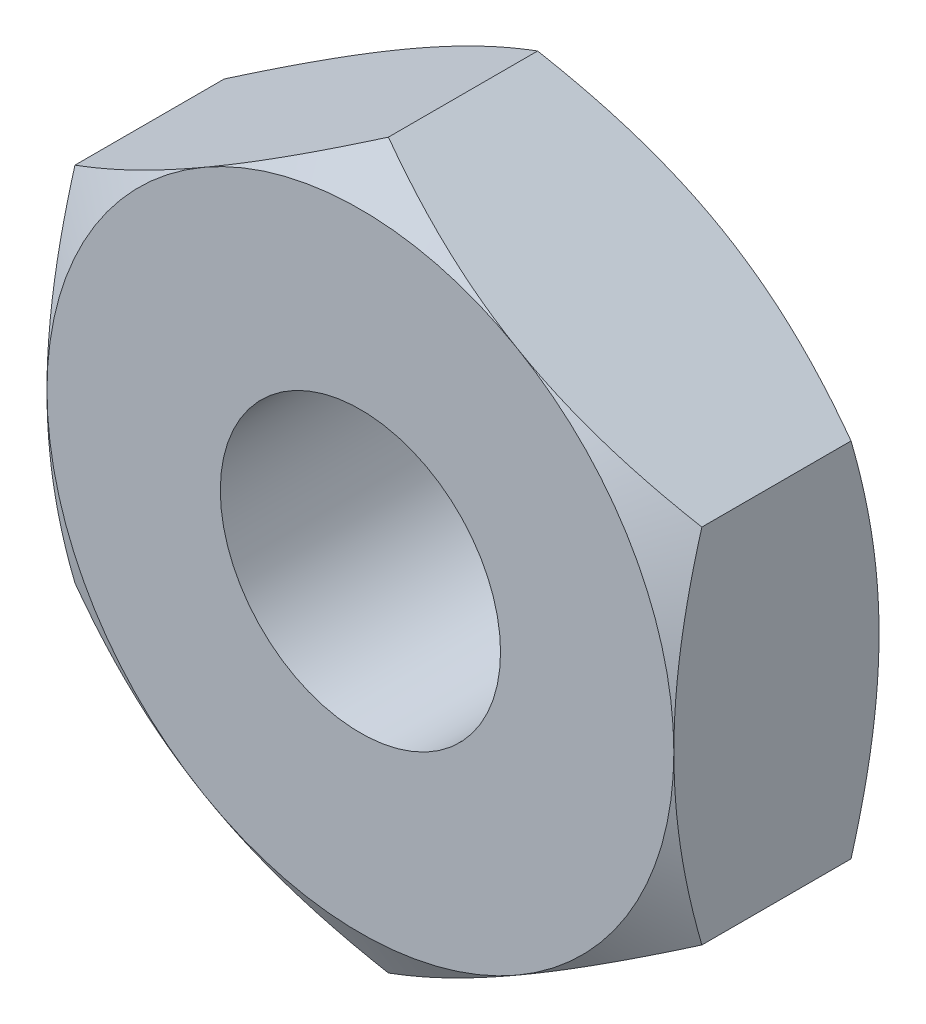
ISO-10303-21;
HEADER;
FILE_DESCRIPTION(('STEP AP214'),'2;1');
FILE_NAME('part.step','',(''),(''),'','','');
FILE_SCHEMA(('AUTOMOTIVE_DESIGN { 1 0 10303 214 1 1 1 1 }'));
ENDSEC;
DATA;
#1=APPLICATION_CONTEXT('core data for automotive mechanical design processes');
#2=APPLICATION_PROTOCOL_DEFINITION('international standard','automotive_design',2000,#1);
#3=PRODUCT_CONTEXT('',#1,'mechanical');
#4=PRODUCT('Part','Part','',(#3));
#5=PRODUCT_RELATED_PRODUCT_CATEGORY('part','',(#4));
#6=PRODUCT_DEFINITION_FORMATION('','',#4);
#7=PRODUCT_DEFINITION_CONTEXT('part definition',#1,'design');
#8=PRODUCT_DEFINITION('design','',#6,#7);
#9=PRODUCT_DEFINITION_SHAPE('','',#8);
#10=(LENGTH_UNIT() NAMED_UNIT(*) SI_UNIT(.MILLI.,.METRE.));
#11=(NAMED_UNIT(*) PLANE_ANGLE_UNIT() SI_UNIT($,.RADIAN.));
#12=(NAMED_UNIT(*) SI_UNIT($,.STERADIAN.) SOLID_ANGLE_UNIT());
#13=UNCERTAINTY_MEASURE_WITH_UNIT(LENGTH_MEASURE(1.E-05),#10,'distance_accuracy_value','');
#14=(GEOMETRIC_REPRESENTATION_CONTEXT(3) GLOBAL_UNCERTAINTY_ASSIGNED_CONTEXT((#13)) GLOBAL_UNIT_ASSIGNED_CONTEXT((#10,
#11,#12)) REPRESENTATION_CONTEXT('',''));
#15=CARTESIAN_POINT('',(0.,0.,0.));
#16=DIRECTION('',(0.,0.,1.));
#17=DIRECTION('',(1.,0.,0.));
#18=AXIS2_PLACEMENT_3D('',#15,#16,#17);
#19=CARTESIAN_POINT('',(2.75,1.58771324027147,1.8));
#20=DIRECTION('',(-0.5,-0.866025403784439,0.));
#21=DIRECTION('',(0.866025403784439,-0.5,0.));
#22=AXIS2_PLACEMENT_3D('',#19,#20,#21);
#23=PLANE('',#22);
#24=CARTESIAN_POINT('',(2.7502,1.58759777021763,1.55431323663524));
#25=CARTESIAN_POINT('',(2.6293507793401,1.65737010029699,1.59461233775074));
#26=CARTESIAN_POINT('',(2.50745839737737,1.72774469983533,1.63126309740234));
#27=CARTESIAN_POINT('',(2.26156287327211,1.86971254687003,1.6952378170302));
#28=CARTESIAN_POINT('',(2.13755536142615,1.94130831721583,1.7225391443255));
#29=CARTESIAN_POINT('',(1.89107720202406,2.08361254889599,1.76503825470588));
#30=CARTESIAN_POINT('',(1.76864448141258,2.15429911309864,1.78051888137754));
#31=CARTESIAN_POINT('',(1.52320285763109,2.29600490065923,1.79900060263006));
#32=CARTESIAN_POINT('',(1.40019484676709,2.36702360884404,1.8020170005374));
#33=CARTESIAN_POINT('',(1.17034121338921,2.49972966594897,1.79574685457145));
#34=CARTESIAN_POINT('',(1.06346120874598,2.56143686540073,1.7879998457233));
#35=CARTESIAN_POINT('',(0.850397532665251,2.68444923614046,1.76344481893565));
#36=CARTESIAN_POINT('',(0.744214598351111,2.74575398185008,1.74662841034943));
#37=CARTESIAN_POINT('',(0.530711510606816,2.86902004703206,1.70458807765404));
#38=CARTESIAN_POINT('',(0.423418383857145,2.93096576264318,1.67918591931277));
#39=CARTESIAN_POINT('',(0.210432520715949,3.05393320806134,1.62153277416002));
#40=CARTESIAN_POINT('',(0.104737054973348,3.11495651365995,1.58929533670102));
#41=CARTESIAN_POINT('',(-0.000200000000000006,3.17554195059678,1.55431323663524));
#42=B_SPLINE_CURVE_WITH_KNOTS('',3,(#24,#25,#26,#27,#28,#29,#30,#31,#32,#33,#34,#35,#36,#37,#38,
#39,#40,#41),.UNSPECIFIED.,.F.,.F.,(4,2,2,2,2,2,2,2,4),(0.,0.435912828725888,0.872873557116332,
1.29901931904672,1.72464171213574,2.09526089052938,2.46622354066374,2.84541551798557,
3.22386274754524),.UNSPECIFIED.);
#43=CARTESIAN_POINT('',(2.75,1.58771324027147,1.55437990693814));
#44=VERTEX_POINT('',#43);
#45=CARTESIAN_POINT('',(1.375,2.38156986040721,1.8));
#46=VERTEX_POINT('',#45);
#47=EDGE_CURVE('E61',#44,#46,#42,.T.);
#48=ORIENTED_EDGE('',*,*,#47,.F.);
#49=DIRECTION('',(0.,0.,-1.));
#50=VECTOR('',#49,1.);
#51=CARTESIAN_POINT('',(2.75,1.58771324027147,1.8));
#52=LINE('',#51,#50);
#53=CARTESIAN_POINT('',(2.75,1.58771324027147,0.245620093061862));
#54=VERTEX_POINT('',#53);
#55=EDGE_CURVE('E300',#44,#54,#52,.T.);
#56=ORIENTED_EDGE('',*,*,#55,.T.);
#57=CARTESIAN_POINT('',(-0.000199999999999888,3.17554195059678,0.245686763364759));
#58=CARTESIAN_POINT('',(0.120649220659906,3.10576962051743,0.205387662249262));
#59=CARTESIAN_POINT('',(0.242541602622634,3.03539502097908,0.168736902597661));
#60=CARTESIAN_POINT('',(0.488437126727893,2.89342717394438,0.1047621829698));
#61=CARTESIAN_POINT('',(0.612444638573855,2.82183140359858,0.0774608556744965));
#62=CARTESIAN_POINT('',(0.858922797975944,2.67952717191842,0.0349617452941162));
#63=CARTESIAN_POINT('',(0.981355518587417,2.60884060771577,0.0194811186224572));
#64=CARTESIAN_POINT('',(1.22679714236892,2.46713482015518,0.000999397369939901));
#65=CARTESIAN_POINT('',(1.34980515323291,2.39611611197038,-0.00201700053740086));
#66=CARTESIAN_POINT('',(1.57965878661079,2.26341005486544,0.00425314542854612));
#67=CARTESIAN_POINT('',(1.68653879125402,2.20170285541369,0.0120001542767018));
#68=CARTESIAN_POINT('',(1.89960246733475,2.07869048467395,0.0365551810643544));
#69=CARTESIAN_POINT('',(2.00578540164889,2.01738573896433,0.0533715896505701));
#70=CARTESIAN_POINT('',(2.21928848939318,1.89411967378235,0.0954119223459561));
#71=CARTESIAN_POINT('',(2.32658161614286,1.83217395817123,0.12081408068723));
#72=CARTESIAN_POINT('',(2.53956747928405,1.70920651275307,0.178467225839981));
#73=CARTESIAN_POINT('',(2.64526294502665,1.64818320715446,0.210704663298982));
#74=CARTESIAN_POINT('',(2.7502,1.58759777021763,0.24568676336476));
#75=B_SPLINE_CURVE_WITH_KNOTS('',3,(#57,#58,#59,#60,#61,#62,#63,#64,#65,#66,#67,#68,#69,#70,#71,
#72,#73,#74),.UNSPECIFIED.,.F.,.F.,(4,2,2,2,2,2,2,2,4),(0.,0.435912828725888,0.872873557116332,
1.29901931904672,1.72464171213573,2.09526089052938,2.46622354066374,2.84541551798557,
3.22386274754524),.UNSPECIFIED.);
#76=CARTESIAN_POINT('',(1.375,2.38156986040721,0.));
#77=VERTEX_POINT('',#76);
#78=EDGE_CURVE('E236',#77,#54,#75,.T.);
#79=ORIENTED_EDGE('',*,*,#78,.F.);
#80=CARTESIAN_POINT('',(0.,3.17542648054294,0.245620093061861));
#81=VERTEX_POINT('',#80);
#82=EDGE_CURVE('E254',#81,#77,#75,.T.);
#83=ORIENTED_EDGE('',*,*,#82,.F.);
#84=DIRECTION('',(0.,0.,-1.));
#85=VECTOR('',#84,1.);
#86=CARTESIAN_POINT('',(0.,3.17542648054294,1.8));
#87=LINE('',#86,#85);
#88=CARTESIAN_POINT('',(0.,3.17542648054294,1.55437990693814));
#89=VERTEX_POINT('',#88);
#90=EDGE_CURVE('E267',#89,#81,#87,.T.);
#91=ORIENTED_EDGE('',*,*,#90,.F.);
#92=EDGE_CURVE('E282',#46,#89,#42,.T.);
#93=ORIENTED_EDGE('',*,*,#92,.F.);
#94=EDGE_LOOP('',(#48,#56,#79,#83,#91,#93));
#95=FACE_BOUND('',#94,.T.);
#96=ADVANCED_FACE('F38',(#95),#23,.F.);
#97=CARTESIAN_POINT('',(0.,3.17542648054294,1.8));
#98=DIRECTION('',(0.5,-0.866025403784439,0.));
#99=DIRECTION('',(0.866025403784439,0.5,0.));
#100=AXIS2_PLACEMENT_3D('',#97,#98,#99);
#101=PLANE('',#100);
#102=CARTESIAN_POINT('',(0.000200000000000053,3.17554195059678,1.55431323663524));
#103=CARTESIAN_POINT('',(-0.120649220659906,3.10576962051743,1.59461233775074));
#104=CARTESIAN_POINT('',(-0.242541602622634,3.03539502097908,1.63126309740234));
#105=CARTESIAN_POINT('',(-0.488437126727893,2.89342717394439,1.6952378170302));
#106=CARTESIAN_POINT('',(-0.612444638573856,2.82183140359858,1.7225391443255));
#107=CARTESIAN_POINT('',(-0.858922797975944,2.67952717191842,1.76503825470588));
#108=CARTESIAN_POINT('',(-0.981355518587417,2.60884060771577,1.78051888137754));
#109=CARTESIAN_POINT('',(-1.22679714236892,2.46713482015519,1.79900060263006));
#110=CARTESIAN_POINT('',(-1.34980515323291,2.39611611197038,1.8020170005374));
#111=CARTESIAN_POINT('',(-1.57965878661079,2.26341005486544,1.79574685457145));
#112=CARTESIAN_POINT('',(-1.68653879125402,2.20170285541369,1.7879998457233));
#113=CARTESIAN_POINT('',(-1.89960246733475,2.07869048467395,1.76344481893565));
#114=CARTESIAN_POINT('',(-2.00578540164889,2.01738573896434,1.74662841034943));
#115=CARTESIAN_POINT('',(-2.21928848939318,1.89411967378235,1.70458807765404));
#116=CARTESIAN_POINT('',(-2.32658161614285,1.83217395817123,1.67918591931277));
#117=CARTESIAN_POINT('',(-2.53956747928405,1.70920651275308,1.62153277416002));
#118=CARTESIAN_POINT('',(-2.64526294502665,1.64818320715446,1.58929533670102));
#119=CARTESIAN_POINT('',(-2.7502,1.58759777021763,1.55431323663524));
#120=B_SPLINE_CURVE_WITH_KNOTS('',3,(#102,#103,#104,#105,#106,#107,#108,#109,#110,#111,#112,
#113,#114,#115,#116,#117,#118,#119),.UNSPECIFIED.,.F.,.F.,(4,2,2,2,2,2,2,2,4),(0.,
0.435912828725888,0.872873557116332,1.29901931904671,1.72464171213573,2.09526089052937,
2.46622354066374,2.84541551798557,3.22386274754524),.UNSPECIFIED.);
#121=CARTESIAN_POINT('',(-1.375,2.38156986040721,1.8));
#122=VERTEX_POINT('',#121);
#123=EDGE_CURVE('E54',#89,#122,#120,.T.);
#124=ORIENTED_EDGE('',*,*,#123,.F.);
#125=ORIENTED_EDGE('',*,*,#90,.T.);
#126=CARTESIAN_POINT('',(-2.7502,1.58759777021763,0.245686763364759));
#127=CARTESIAN_POINT('',(-2.62935077934009,1.65737010029699,0.205387662249262));
#128=CARTESIAN_POINT('',(-2.50745839737737,1.72774469983533,0.168736902597661));
#129=CARTESIAN_POINT('',(-2.26156287327211,1.86971254687003,0.1047621829698));
#130=CARTESIAN_POINT('',(-2.13755536142614,1.94130831721583,0.0774608556744971));
#131=CARTESIAN_POINT('',(-1.89107720202406,2.08361254889599,0.0349617452941167));
#132=CARTESIAN_POINT('',(-1.76864448141258,2.15429911309864,0.0194811186224577));
#133=CARTESIAN_POINT('',(-1.52320285763108,2.29600490065923,0.000999397369940247));
#134=CARTESIAN_POINT('',(-1.40019484676709,2.36702360884404,-0.00201700053740059));
#135=CARTESIAN_POINT('',(-1.17034121338921,2.49972966594897,0.00425314542854635));
#136=CARTESIAN_POINT('',(-1.06346120874598,2.56143686540073,0.012000154276702));
#137=CARTESIAN_POINT('',(-0.850397532665249,2.68444923614047,0.0365551810643545));
#138=CARTESIAN_POINT('',(-0.74421459835111,2.74575398185008,0.05337158965057));
#139=CARTESIAN_POINT('',(-0.530711510606816,2.86902004703206,0.0954119223459559));
#140=CARTESIAN_POINT('',(-0.423418383857144,2.93096576264318,0.12081408068723));
#141=CARTESIAN_POINT('',(-0.210432520715948,3.05393320806134,0.178467225839981));
#142=CARTESIAN_POINT('',(-0.104737054973347,3.11495651365995,0.210704663298981));
#143=CARTESIAN_POINT('',(0.000200000000000298,3.17554195059678,0.245686763364759));
#144=B_SPLINE_CURVE_WITH_KNOTS('',3,(#126,#127,#128,#129,#130,#131,#132,#133,#134,#135,#136,
#137,#138,#139,#140,#141,#142,#143),.UNSPECIFIED.,.F.,.F.,(4,2,2,2,2,2,2,2,4),(0.,
0.435912828725888,0.872873557116332,1.29901931904671,1.72464171213574,2.09526089052937,
2.46622354066374,2.84541551798557,3.22386274754524),.UNSPECIFIED.);
#145=CARTESIAN_POINT('',(-1.375,2.38156986040721,0.));
#146=VERTEX_POINT('',#145);
#147=EDGE_CURVE('E198',#146,#81,#144,.T.);
#148=ORIENTED_EDGE('',*,*,#147,.F.);
#149=CARTESIAN_POINT('',(-2.75,1.58771324027147,0.245620093061861));
#150=VERTEX_POINT('',#149);
#151=EDGE_CURVE('E253',#150,#146,#144,.T.);
#152=ORIENTED_EDGE('',*,*,#151,.F.);
#153=DIRECTION('',(0.,0.,-1.));
#154=VECTOR('',#153,1.);
#155=CARTESIAN_POINT('',(-2.75,1.58771324027147,1.8));
#156=LINE('',#155,#154);
#157=CARTESIAN_POINT('',(-2.75,1.58771324027147,1.55437990693814));
#158=VERTEX_POINT('',#157);
#159=EDGE_CURVE('E291',#158,#150,#156,.T.);
#160=ORIENTED_EDGE('',*,*,#159,.F.);
#161=EDGE_CURVE('E133',#122,#158,#120,.T.);
#162=ORIENTED_EDGE('',*,*,#161,.F.);
#163=EDGE_LOOP('',(#124,#125,#148,#152,#160,#162));
#164=FACE_BOUND('',#163,.T.);
#165=ADVANCED_FACE('F182',(#164),#101,.F.);
#166=CARTESIAN_POINT('',(-2.75,1.58771324027147,1.8));
#167=DIRECTION('',(1.,0.,0.));
#168=DIRECTION('',(0.,1.,0.));
#169=AXIS2_PLACEMENT_3D('',#166,#167,#168);
#170=PLANE('',#169);
#171=CARTESIAN_POINT('',(-2.75,-4.30229228232547,0.439707197618394));
#172=CARTESIAN_POINT('',(-2.75,-4.1818458840318,0.498284300835328));
#173=CARTESIAN_POINT('',(-2.75,-4.06112695506836,0.556310429020307));
#174=CARTESIAN_POINT('',(-2.75,-3.81899921609404,0.670951536801396));
#175=CARTESIAN_POINT('',(-2.75,-3.69759030422136,0.727566301023872));
#176=CARTESIAN_POINT('',(-2.75,-3.45333025002757,0.839352243109175));
#177=CARTESIAN_POINT('',(-2.75,-3.33047487631149,0.894514206352241));
#178=CARTESIAN_POINT('',(-2.75,-3.08379982874787,1.0026297898233));
#179=CARTESIAN_POINT('',(-2.75,-2.95998019973468,1.05558351200746));
#180=CARTESIAN_POINT('',(-2.75,-2.70707489769887,1.16040203121101));
#181=CARTESIAN_POINT('',(-2.75,-2.57795024698219,1.21217328677259));
#182=CARTESIAN_POINT('',(-2.75,-2.31820426001997,1.31188757178913));
#183=CARTESIAN_POINT('',(-2.75,-2.18758275976092,1.35983017705319));
#184=CARTESIAN_POINT('',(-2.75,-1.92486771343281,1.45065625126762));
#185=CARTESIAN_POINT('',(-2.75,-1.79277762987959,1.49354963680654));
#186=CARTESIAN_POINT('',(-2.75,-1.52670308415344,1.572925859744));
#187=CARTESIAN_POINT('',(-2.75,-1.3927192206662,1.60941067620219));
#188=CARTESIAN_POINT('',(-2.75,-1.1235150238249,1.67405197809997));
#189=CARTESIAN_POINT('',(-2.75,-0.988305818075371,1.70225396277259));
#190=CARTESIAN_POINT('',(-2.75,-0.716167543399858,1.74875630710074));
#191=CARTESIAN_POINT('',(-2.75,-0.579238655538784,1.76705770039082));
#192=CARTESIAN_POINT('',(-2.75,-0.306149321491176,1.79206096143369));
#193=CARTESIAN_POINT('',(-2.75,-0.170003154167318,1.79891493461807));
#194=CARTESIAN_POINT('',(-2.75,0.102386202114088,1.80084510391155));
#195=CARTESIAN_POINT('',(-2.75,0.238629392936334,1.79592106719786));
#196=CARTESIAN_POINT('',(-2.75,0.468799582135478,1.77800509627898));
#197=CARTESIAN_POINT('',(-2.75,0.562968249084189,1.76792941635978));
#198=CARTESIAN_POINT('',(-2.75,0.750636767361877,1.742758272155));
#199=CARTESIAN_POINT('',(-2.75,0.844136530597805,1.7276621586842));
#200=CARTESIAN_POINT('',(-2.75,1.1234938832665,1.67563452032961));
#201=CARTESIAN_POINT('',(-2.75,1.30811302056124,1.63197222683863));
#202=CARTESIAN_POINT('',(-2.75,1.58428098850325,1.55598500816786));
#203=CARTESIAN_POINT('',(-2.75,1.67725301880762,1.52853583058857));
#204=CARTESIAN_POINT('',(-2.75,1.86229424929004,1.47071997659582));
#205=CARTESIAN_POINT('',(-2.75,1.95436344276194,1.44035327852948));
#206=CARTESIAN_POINT('',(-2.75,2.13762784989206,1.37719528958947));
#207=CARTESIAN_POINT('',(-2.75,2.22882331702194,1.34440472752573));
#208=CARTESIAN_POINT('',(-2.75,2.41045326863395,1.27679148988343));
#209=CARTESIAN_POINT('',(-2.75,2.50088776846761,1.24196885541231));
#210=CARTESIAN_POINT('',(-2.75,2.73803868969437,1.14808005390151));
#211=CARTESIAN_POINT('',(-2.75,2.88419612747981,1.08760350826135));
#212=CARTESIAN_POINT('',(-2.75,3.17506436957396,0.96325464018301));
#213=CARTESIAN_POINT('',(-2.75,3.31977503021261,0.899381984401183));
#214=CARTESIAN_POINT('',(-2.75,3.60806551601094,0.769024013441061));
#215=CARTESIAN_POINT('',(-2.75,3.75164497381424,0.702537888384701));
#216=CARTESIAN_POINT('',(-2.75,4.03785436509433,0.567548761527505));
#217=CARTESIAN_POINT('',(-2.75,4.18048427146293,0.499045702446555));
#218=CARTESIAN_POINT('',(-2.75,4.6076364132657,0.290980970777297));
#219=CARTESIAN_POINT('',(-2.75,4.89100559299335,0.149054883544251));
#220=CARTESIAN_POINT('',(-2.75,5.45562064216358,-0.138800842047396));
#221=CARTESIAN_POINT('',(-2.75,5.73686689915124,-0.284729725984209));
#222=CARTESIAN_POINT('',(-2.75,6.26953449157304,-0.564442758142764));
#223=CARTESIAN_POINT('',(-2.75,6.52109503875703,-0.697962263738087));
#224=CARTESIAN_POINT('',(-2.75,7.02335674484667,-0.966638390737848));
#225=CARTESIAN_POINT('',(-2.75,7.27405785557794,-1.1017951020487));
#226=CARTESIAN_POINT('',(-2.75,7.77401000454292,-1.3729017752607));
#227=CARTESIAN_POINT('',(-2.75,8.02326312349595,-1.50884790467369));
#228=CARTESIAN_POINT('',(-2.75,8.52123126857091,-1.78167969546658));
#229=CARTESIAN_POINT('',(-2.75,8.7699463325139,-1.91856528778751));
#230=CARTESIAN_POINT('',(-2.75,9.01847061978974,-2.05579397230175));
#231=B_SPLINE_CURVE_WITH_KNOTS('',3,(#171,#172,#173,#174,#175,#176,#177,#178,#179,#180,#181,
#182,#183,#184,#185,#186,#187,#188,#189,#190,#191,#192,#193,#194,#195,#196,#197,#198,#199,#200,
#201,#202,#203,#204,#205,#206,#207,#208,#209,#210,#211,#212,#213,#214,#215,#216,#217,#218,#219,
#220,#221,#222,#223,#224,#225,#226,#227,#228,#229,#230),.UNSPECIFIED.,.F.,.F.,(4,2,2,2,2,2,2,2,
2,2,2,2,2,2,2,2,2,2,2,2,2,2,2,2,2,2,2,2,2,4),(0.,0.401810043663553,0.803681032642591,
1.20767668636424,1.61165366660062,2.02895662713465,2.44630575830953,2.86282104124558,
3.27920747117523,3.6932618877197,4.10727306810034,4.51573806437011,4.92421113507199,
5.20819264163157,5.49221088372843,6.06053671698079,6.35132938300498,6.64212420736392,
6.93283194813754,7.22353381012826,7.69799655587241,8.17250595857326,8.64716358267414,
9.12183469988749,10.0725485860888,11.0230845025451,11.877471677801,12.731905985979,
13.5836526424904,14.4353373446199),.UNSPECIFIED.);
#232=CARTESIAN_POINT('',(-2.75,0.,1.8));
#233=VERTEX_POINT('',#232);
#234=EDGE_CURVE('E127',#158,#233,#231,.F.);
#235=ORIENTED_EDGE('',*,*,#234,.F.);
#236=ORIENTED_EDGE('',*,*,#159,.T.);
#237=CARTESIAN_POINT('',(-2.75,-4.30229228232547,1.36029280238161));
#238=CARTESIAN_POINT('',(-2.75,-4.1818458840318,1.30171569916467));
#239=CARTESIAN_POINT('',(-2.75,-4.06112695506836,1.24368957097969));
#240=CARTESIAN_POINT('',(-2.75,-3.81899921609404,1.1290484631986));
#241=CARTESIAN_POINT('',(-2.75,-3.69759030422136,1.07243369897613));
#242=CARTESIAN_POINT('',(-2.75,-3.45333025002757,0.960647756890825));
#243=CARTESIAN_POINT('',(-2.75,-3.33047487631149,0.905485793647759));
#244=CARTESIAN_POINT('',(-2.75,-3.08379982874787,0.797370210176701));
#245=CARTESIAN_POINT('',(-2.75,-2.95998019973468,0.744416487992542));
#246=CARTESIAN_POINT('',(-2.75,-2.70707489769887,0.639597968788989));
#247=CARTESIAN_POINT('',(-2.75,-2.57795024698219,0.587826713227409));
#248=CARTESIAN_POINT('',(-2.75,-2.31820426001997,0.48811242821087));
#249=CARTESIAN_POINT('',(-2.75,-2.18758275976092,0.440169822946811));
#250=CARTESIAN_POINT('',(-2.75,-1.92486771343281,0.349343748732378));
#251=CARTESIAN_POINT('',(-2.75,-1.79277762987959,0.306450363193461));
#252=CARTESIAN_POINT('',(-2.75,-1.52670308415344,0.227074140255999));
#253=CARTESIAN_POINT('',(-2.75,-1.3927192206662,0.190589323797809));
#254=CARTESIAN_POINT('',(-2.75,-1.1235150238249,0.125948021900027));
#255=CARTESIAN_POINT('',(-2.75,-0.988305818075372,0.0977460372274074));
#256=CARTESIAN_POINT('',(-2.75,-0.716167543399859,0.0512436928992635));
#257=CARTESIAN_POINT('',(-2.75,-0.579238655538784,0.0329422996091773));
#258=CARTESIAN_POINT('',(-2.75,-0.306149321491176,0.00793903856630559));
#259=CARTESIAN_POINT('',(-2.75,-0.170003154167319,0.00108506538192604));
#260=CARTESIAN_POINT('',(-2.75,0.102386202114087,-0.000845103911545709));
#261=CARTESIAN_POINT('',(-2.75,0.238629392936333,0.00407893280214057));
#262=CARTESIAN_POINT('',(-2.75,0.468799582135477,0.0219949037210218));
#263=CARTESIAN_POINT('',(-2.75,0.562968249084189,0.0320705836402213));
#264=CARTESIAN_POINT('',(-2.75,0.750636767361878,0.0572417278450011));
#265=CARTESIAN_POINT('',(-2.75,0.844136530597805,0.0723378413157966));
#266=CARTESIAN_POINT('',(-2.75,1.1234938832665,0.124365479670388));
#267=CARTESIAN_POINT('',(-2.75,1.30811302056124,0.168027773161373));
#268=CARTESIAN_POINT('',(-2.75,1.58428098850325,0.244014991832136));
#269=CARTESIAN_POINT('',(-2.75,1.67725301880762,0.271464169411433));
#270=CARTESIAN_POINT('',(-2.75,1.86229424929004,0.329280023404184));
#271=CARTESIAN_POINT('',(-2.75,1.95436344276194,0.35964672147052));
#272=CARTESIAN_POINT('',(-2.75,2.13762784989206,0.422804710410531));
#273=CARTESIAN_POINT('',(-2.75,2.22882331702194,0.455595272474266));
#274=CARTESIAN_POINT('',(-2.75,2.41045326863395,0.523208510116568));
#275=CARTESIAN_POINT('',(-2.75,2.50088776846761,0.558031144587691));
#276=CARTESIAN_POINT('',(-2.75,2.73803868969437,0.651919946098493));
#277=CARTESIAN_POINT('',(-2.75,2.8841961274798,0.712396491738649));
#278=CARTESIAN_POINT('',(-2.75,3.17506436957396,0.836745359816989));
#279=CARTESIAN_POINT('',(-2.75,3.31977503021261,0.900618015598816));
#280=CARTESIAN_POINT('',(-2.75,3.60806551601094,1.03097598655894));
#281=CARTESIAN_POINT('',(-2.75,3.75164497381423,1.0974621116153));
#282=CARTESIAN_POINT('',(-2.75,4.03785436509433,1.23245123847249));
#283=CARTESIAN_POINT('',(-2.75,4.18048427146293,1.30095429755344));
#284=CARTESIAN_POINT('',(-2.75,4.6076364132657,1.5090190292227));
#285=CARTESIAN_POINT('',(-2.75,4.89100559299334,1.65094511645575));
#286=CARTESIAN_POINT('',(-2.75,5.45562064216358,1.93880084204739));
#287=CARTESIAN_POINT('',(-2.75,5.73686689915124,2.08472972598421));
#288=CARTESIAN_POINT('',(-2.75,6.26953449157304,2.36444275814276));
#289=CARTESIAN_POINT('',(-2.75,6.52109503875703,2.49796226373808));
#290=CARTESIAN_POINT('',(-2.75,7.02335674484666,2.76663839073785));
#291=CARTESIAN_POINT('',(-2.75,7.27405785557793,2.9017951020487));
#292=CARTESIAN_POINT('',(-2.75,7.77401000454292,3.1729017752607));
#293=CARTESIAN_POINT('',(-2.75,8.02326312349595,3.30884790467369));
#294=CARTESIAN_POINT('',(-2.75,8.52123126857091,3.58167969546658));
#295=CARTESIAN_POINT('',(-2.75,8.7699463325139,3.71856528778751));
#296=CARTESIAN_POINT('',(-2.75,9.01847061978974,3.85579397230175));
#297=B_SPLINE_CURVE_WITH_KNOTS('',3,(#237,#238,#239,#240,#241,#242,#243,#244,#245,#246,#247,
#248,#249,#250,#251,#252,#253,#254,#255,#256,#257,#258,#259,#260,#261,#262,#263,#264,#265,#266,
#267,#268,#269,#270,#271,#272,#273,#274,#275,#276,#277,#278,#279,#280,#281,#282,#283,#284,#285,
#286,#287,#288,#289,#290,#291,#292,#293,#294,#295,#296),.UNSPECIFIED.,.F.,.F.,(4,2,2,2,2,2,2,2,
2,2,2,2,2,2,2,2,2,2,2,2,2,2,2,2,2,2,2,2,2,4),(0.,0.401810043663553,0.803681032642591,
1.20767668636424,1.61165366660062,2.02895662713465,2.44630575830953,2.86282104124558,
3.27920747117524,3.6932618877197,4.10727306810034,4.51573806437011,4.92421113507199,
5.20819264163157,5.49221088372843,6.06053671698079,6.35132938300499,6.64212420736392,
6.93283194813755,7.22353381012826,7.69799655587241,8.17250595857326,8.64716358267414,
9.12183469988749,10.0725485860888,11.0230845025451,11.877471677801,12.731905985979,
13.5836526424904,14.4353373446199),.UNSPECIFIED.);
#298=CARTESIAN_POINT('',(-2.75,0.,0.));
#299=VERTEX_POINT('',#298);
#300=EDGE_CURVE('E188',#299,#150,#297,.T.);
#301=ORIENTED_EDGE('',*,*,#300,.F.);
#302=CARTESIAN_POINT('',(-2.75,-1.58771324027147,0.245620093061861));
#303=VERTEX_POINT('',#302);
#304=EDGE_CURVE('E196',#303,#299,#297,.T.);
#305=ORIENTED_EDGE('',*,*,#304,.F.);
#306=DIRECTION('',(0.,0.,-1.));
#307=VECTOR('',#306,1.);
#308=CARTESIAN_POINT('',(-2.75,-1.58771324027147,1.8));
#309=LINE('',#308,#307);
#310=CARTESIAN_POINT('',(-2.75,-1.58771324027147,1.55437990693814));
#311=VERTEX_POINT('',#310);
#312=EDGE_CURVE('E155',#311,#303,#309,.T.);
#313=ORIENTED_EDGE('',*,*,#312,.F.);
#314=EDGE_CURVE('E137',#233,#311,#231,.F.);
#315=ORIENTED_EDGE('',*,*,#314,.F.);
#316=EDGE_LOOP('',(#235,#236,#301,#305,#313,#315));
#317=FACE_BOUND('',#316,.T.);
#318=ADVANCED_FACE('F153',(#317),#170,.F.);
#319=CARTESIAN_POINT('',(-2.75,-1.58771324027147,1.8));
#320=DIRECTION('',(0.5,0.866025403784439,0.));
#321=DIRECTION('',(-0.866025403784439,0.5,0.));
#322=AXIS2_PLACEMENT_3D('',#319,#320,#321);
#323=PLANE('',#322);
#324=CARTESIAN_POINT('',(-2.7502,-1.58759777021763,1.55431323663524));
#325=CARTESIAN_POINT('',(-2.62935077934009,-1.65737010029699,1.59461233775074));
#326=CARTESIAN_POINT('',(-2.50745839737737,-1.72774469983533,1.63126309740234));
#327=CARTESIAN_POINT('',(-2.26156287327211,-1.86971254687003,1.6952378170302));
#328=CARTESIAN_POINT('',(-2.13755536142614,-1.94130831721583,1.7225391443255));
#329=CARTESIAN_POINT('',(-1.89107720202406,-2.08361254889599,1.76503825470588));
#330=CARTESIAN_POINT('',(-1.76864448141258,-2.15429911309864,1.78051888137754));
#331=CARTESIAN_POINT('',(-1.52320285763108,-2.29600490065923,1.79900060263006));
#332=CARTESIAN_POINT('',(-1.40019484676709,-2.36702360884404,1.8020170005374));
#333=CARTESIAN_POINT('',(-1.17034121338921,-2.49972966594897,1.79574685457145));
#334=CARTESIAN_POINT('',(-1.06346120874598,-2.56143686540073,1.7879998457233));
#335=CARTESIAN_POINT('',(-0.85039753266525,-2.68444923614047,1.76344481893565));
#336=CARTESIAN_POINT('',(-0.744214598351111,-2.74575398185008,1.74662841034943));
#337=CARTESIAN_POINT('',(-0.530711510606816,-2.86902004703206,1.70458807765404));
#338=CARTESIAN_POINT('',(-0.423418383857145,-2.93096576264318,1.67918591931277));
#339=CARTESIAN_POINT('',(-0.210432520715949,-3.05393320806134,1.62153277416002));
#340=CARTESIAN_POINT('',(-0.104737054973347,-3.11495651365995,1.58929533670102));
#341=CARTESIAN_POINT('',(0.00019999999999996,-3.17554195059678,1.55431323663524));
#342=B_SPLINE_CURVE_WITH_KNOTS('',3,(#324,#325,#326,#327,#328,#329,#330,#331,#332,#333,#334,
#335,#336,#337,#338,#339,#340,#341),.UNSPECIFIED.,.F.,.F.,(4,2,2,2,2,2,2,2,4),(0.,
0.435912828725888,0.872873557116332,1.29901931904672,1.72464171213574,2.09526089052937,
2.46622354066374,2.84541551798557,3.22386274754524),.UNSPECIFIED.);
#343=CARTESIAN_POINT('',(-1.375,-2.38156986040721,1.8));
#344=VERTEX_POINT('',#343);
#345=EDGE_CURVE('E144',#311,#344,#342,.T.);
#346=ORIENTED_EDGE('',*,*,#345,.F.);
#347=ORIENTED_EDGE('',*,*,#312,.T.);
#348=CARTESIAN_POINT('',(0.000199999999999349,-3.17554195059678,0.245686763364758));
#349=CARTESIAN_POINT('',(-0.120649220659907,-3.10576962051743,0.205387662249262));
#350=CARTESIAN_POINT('',(-0.242541602622635,-3.03539502097908,0.168736902597661));
#351=CARTESIAN_POINT('',(-0.488437126727893,-2.89342717394438,0.1047621829698));
#352=CARTESIAN_POINT('',(-0.612444638573856,-2.82183140359858,0.0774608556744966));
#353=CARTESIAN_POINT('',(-0.858922797975944,-2.67952717191842,0.0349617452941161));
#354=CARTESIAN_POINT('',(-0.981355518587418,-2.60884060771577,0.0194811186224571));
#355=CARTESIAN_POINT('',(-1.22679714236892,-2.46713482015518,0.000999397369939942));
#356=CARTESIAN_POINT('',(-1.34980515323291,-2.39611611197038,-0.0020170005374007));
#357=CARTESIAN_POINT('',(-1.57965878661079,-2.26341005486544,0.00425314542854644));
#358=CARTESIAN_POINT('',(-1.68653879125402,-2.20170285541369,0.0120001542767021));
#359=CARTESIAN_POINT('',(-1.89960246733475,-2.07869048467395,0.0365551810643545));
#360=CARTESIAN_POINT('',(-2.00578540164889,-2.01738573896433,0.05337158965057));
#361=CARTESIAN_POINT('',(-2.21928848939318,-1.89411967378235,0.0954119223459559));
#362=CARTESIAN_POINT('',(-2.32658161614285,-1.83217395817123,0.12081408068723));
#363=CARTESIAN_POINT('',(-2.53956747928405,-1.70920651275308,0.178467225839981));
#364=CARTESIAN_POINT('',(-2.64526294502665,-1.64818320715446,0.210704663298982));
#365=CARTESIAN_POINT('',(-2.7502,-1.58759777021763,0.245686763364759));
#366=B_SPLINE_CURVE_WITH_KNOTS('',3,(#348,#349,#350,#351,#352,#353,#354,#355,#356,#357,#358,
#359,#360,#361,#362,#363,#364,#365),.UNSPECIFIED.,.F.,.F.,(4,2,2,2,2,2,2,2,4),(0.,
0.435912828725888,0.872873557116332,1.29901931904671,1.72464171213574,2.09526089052937,
2.46622354066374,2.84541551798557,3.22386274754524),.UNSPECIFIED.);
#367=CARTESIAN_POINT('',(-1.375,-2.38156986040721,0.));
#368=VERTEX_POINT('',#367);
#369=EDGE_CURVE('E197',#368,#303,#366,.T.);
#370=ORIENTED_EDGE('',*,*,#369,.F.);
#371=CARTESIAN_POINT('',(0.,-3.17542648054294,0.245620093061861));
#372=VERTEX_POINT('',#371);
#373=EDGE_CURVE('E241',#372,#368,#366,.T.);
#374=ORIENTED_EDGE('',*,*,#373,.F.);
#375=DIRECTION('',(0.,0.,-1.));
#376=VECTOR('',#375,1.);
#377=CARTESIAN_POINT('',(0.,-3.17542648054294,1.8));
#378=LINE('',#377,#376);
#379=CARTESIAN_POINT('',(0.,-3.17542648054294,1.55437990693814));
#380=VERTEX_POINT('',#379);
#381=EDGE_CURVE('E296',#380,#372,#378,.T.);
#382=ORIENTED_EDGE('',*,*,#381,.F.);
#383=EDGE_CURVE('E156',#344,#380,#342,.T.);
#384=ORIENTED_EDGE('',*,*,#383,.F.);
#385=EDGE_LOOP('',(#346,#347,#370,#374,#382,#384));
#386=FACE_BOUND('',#385,.T.);
#387=ADVANCED_FACE('F181',(#386),#323,.F.);
#388=CARTESIAN_POINT('',(0.,-3.17542648054294,1.8));
#389=DIRECTION('',(-0.499999999999999,0.866025403784439,0.));
#390=DIRECTION('',(-0.866025403784439,-0.5,0.));
#391=AXIS2_PLACEMENT_3D('',#388,#389,#390);
#392=PLANE('',#391);
#393=CARTESIAN_POINT('',(-0.000200000000000711,-3.17554195059678,1.55431323663524));
#394=CARTESIAN_POINT('',(0.120649220659905,-3.10576962051743,1.59461233775074));
#395=CARTESIAN_POINT('',(0.242541602622633,-3.03539502097908,1.63126309740234));
#396=CARTESIAN_POINT('',(0.488437126727892,-2.89342717394438,1.6952378170302));
#397=CARTESIAN_POINT('',(0.612444638573855,-2.82183140359858,1.7225391443255));
#398=CARTESIAN_POINT('',(0.858922797975943,-2.67952717191842,1.76503825470588));
#399=CARTESIAN_POINT('',(0.981355518587416,-2.60884060771577,1.78051888137754));
#400=CARTESIAN_POINT('',(1.22679714236891,-2.46713482015518,1.79900060263006));
#401=CARTESIAN_POINT('',(1.34980515323291,-2.39611611197038,1.8020170005374));
#402=CARTESIAN_POINT('',(1.57965878661079,-2.26341005486544,1.79574685457145));
#403=CARTESIAN_POINT('',(1.68653879125402,-2.20170285541369,1.7879998457233));
#404=CARTESIAN_POINT('',(1.89960246733475,-2.07869048467395,1.76344481893565));
#405=CARTESIAN_POINT('',(2.00578540164889,-2.01738573896433,1.74662841034943));
#406=CARTESIAN_POINT('',(2.21928848939318,-1.89411967378235,1.70458807765404));
#407=CARTESIAN_POINT('',(2.32658161614285,-1.83217395817123,1.67918591931277));
#408=CARTESIAN_POINT('',(2.53956747928405,-1.70920651275308,1.62153277416002));
#409=CARTESIAN_POINT('',(2.64526294502665,-1.64818320715446,1.58929533670102));
#410=CARTESIAN_POINT('',(2.7502,-1.58759777021763,1.55431323663524));
#411=B_SPLINE_CURVE_WITH_KNOTS('',3,(#393,#394,#395,#396,#397,#398,#399,#400,#401,#402,#403,
#404,#405,#406,#407,#408,#409,#410),.UNSPECIFIED.,.F.,.F.,(4,2,2,2,2,2,2,2,4),(0.,
0.435912828725888,0.872873557116331,1.29901931904671,1.72464171213573,2.09526089052937,
2.46622354066374,2.84541551798557,3.22386274754524),.UNSPECIFIED.);
#412=CARTESIAN_POINT('',(1.375,-2.38156986040721,1.8));
#413=VERTEX_POINT('',#412);
#414=EDGE_CURVE('E416',#380,#413,#411,.T.);
#415=ORIENTED_EDGE('',*,*,#414,.F.);
#416=ORIENTED_EDGE('',*,*,#381,.T.);
#417=CARTESIAN_POINT('',(2.7502,-1.58759777021763,0.24568676336476));
#418=CARTESIAN_POINT('',(2.62935077934009,-1.65737010029699,0.205387662249262));
#419=CARTESIAN_POINT('',(2.50745839737737,-1.72774469983533,0.168736902597661));
#420=CARTESIAN_POINT('',(2.26156287327211,-1.86971254687003,0.1047621829698));
#421=CARTESIAN_POINT('',(2.13755536142614,-1.94130831721583,0.0774608556744969));
#422=CARTESIAN_POINT('',(1.89107720202406,-2.08361254889599,0.0349617452941163));
#423=CARTESIAN_POINT('',(1.76864448141258,-2.15429911309864,0.0194811186224572));
#424=CARTESIAN_POINT('',(1.52320285763108,-2.29600490065923,0.000999397369939928));
#425=CARTESIAN_POINT('',(1.40019484676709,-2.36702360884404,-0.00201700053740072));
#426=CARTESIAN_POINT('',(1.17034121338921,-2.49972966594897,0.00425314542854611));
#427=CARTESIAN_POINT('',(1.06346120874598,-2.56143686540073,0.0120001542767016));
#428=CARTESIAN_POINT('',(0.85039753266525,-2.68444923614047,0.0365551810643539));
#429=CARTESIAN_POINT('',(0.74421459835111,-2.74575398185008,0.0533715896505696));
#430=CARTESIAN_POINT('',(0.530711510606816,-2.86902004703206,0.0954119223459554));
#431=CARTESIAN_POINT('',(0.423418383857144,-2.93096576264318,0.120814080687229));
#432=CARTESIAN_POINT('',(0.210432520715948,-3.05393320806134,0.17846722583998));
#433=CARTESIAN_POINT('',(0.104737054973347,-3.11495651365995,0.210704663298981));
#434=CARTESIAN_POINT('',(-0.000200000000000863,-3.17554195059678,0.245686763364759));
#435=B_SPLINE_CURVE_WITH_KNOTS('',3,(#417,#418,#419,#420,#421,#422,#423,#424,#425,#426,#427,
#428,#429,#430,#431,#432,#433,#434),.UNSPECIFIED.,.F.,.F.,(4,2,2,2,2,2,2,2,4),(0.,
0.435912828725889,0.872873557116332,1.29901931904672,1.72464171213574,2.09526089052938,
2.46622354066374,2.84541551798557,3.22386274754524),.UNSPECIFIED.);
#436=CARTESIAN_POINT('',(1.375,-2.38156986040721,0.));
#437=VERTEX_POINT('',#436);
#438=EDGE_CURVE('E247',#437,#372,#435,.T.);
#439=ORIENTED_EDGE('',*,*,#438,.F.);
#440=CARTESIAN_POINT('',(2.75,-1.58771324027169,0.245620093061715));
#441=VERTEX_POINT('',#440);
#442=EDGE_CURVE('E229',#441,#437,#435,.T.);
#443=ORIENTED_EDGE('',*,*,#442,.F.);
#444=DIRECTION('',(0.,0.,-1.));
#445=VECTOR('',#444,1.);
#446=CARTESIAN_POINT('',(2.75,-1.58771324027147,1.8));
#447=LINE('',#446,#445);
#448=CARTESIAN_POINT('',(2.75,-1.58771324027169,1.55437990693828));
#449=VERTEX_POINT('',#448);
#450=EDGE_CURVE('E298',#449,#441,#447,.T.);
#451=ORIENTED_EDGE('',*,*,#450,.F.);
#452=EDGE_CURVE('E409',#413,#449,#411,.T.);
#453=ORIENTED_EDGE('',*,*,#452,.F.);
#454=EDGE_LOOP('',(#415,#416,#439,#443,#451,#453));
#455=FACE_BOUND('',#454,.T.);
#456=ADVANCED_FACE('F317',(#455),#392,.F.);
#457=CARTESIAN_POINT('',(2.75,-1.58771324027147,1.8));
#458=DIRECTION('',(-1.,0.,0.));
#459=DIRECTION('',(0.,-1.,0.));
#460=AXIS2_PLACEMENT_3D('',#457,#458,#459);
#461=PLANE('',#460);
#462=CARTESIAN_POINT('',(2.75,-4.30229228147667,0.439707198031302));
#463=CARTESIAN_POINT('',(2.75,-4.18184588321157,0.498284301230996));
#464=CARTESIAN_POINT('',(2.75,-4.06112695427671,0.556310429398744));
#465=CARTESIAN_POINT('',(2.75,-3.81899921535963,0.670951537145454));
#466=CARTESIAN_POINT('',(2.75,-3.69759030351562,0.727566301350783));
#467=CARTESIAN_POINT('',(2.75,-3.4533302493796,0.839352243401779));
#468=CARTESIAN_POINT('',(2.75,-3.33047487569264,0.894514206627689));
#469=CARTESIAN_POINT('',(2.75,-3.08379982818744,1.00262979006472));
#470=CARTESIAN_POINT('',(2.75,-2.95998019920356,1.05558351223201));
#471=CARTESIAN_POINT('',(2.75,-2.7070748972286,1.16040203140135));
#472=CARTESIAN_POINT('',(2.75,-2.57795024654349,1.21217328694563));
#473=CARTESIAN_POINT('',(2.75,-2.3182042596449,1.31188757192849));
#474=CARTESIAN_POINT('',(2.75,-2.18758275941794,1.35983017717617));
#475=CARTESIAN_POINT('',(2.75,-1.92486771315457,1.45065625135942));
#476=CARTESIAN_POINT('',(2.75,-1.79277762963402,1.49354963688352));
#477=CARTESIAN_POINT('',(2.75,-1.5267030839741,1.57292585979378));
#478=CARTESIAN_POINT('',(2.75,-1.39271922052041,1.60941067623958));
#479=CARTESIAN_POINT('',(2.75,-1.12351502376349,1.67405197811235));
#480=CARTESIAN_POINT('',(2.75,-0.98830581806502,1.70225396277332));
#481=CARTESIAN_POINT('',(2.75,-0.716167543492841,1.74875630708588));
#482=CARTESIAN_POINT('',(2.75,-0.579238655684047,1.76705770037202));
#483=CARTESIAN_POINT('',(2.75,-0.306149321740134,1.79206096141632));
#484=CARTESIAN_POINT('',(2.75,-0.17000315446768,1.7989149346059));
#485=CARTESIAN_POINT('',(2.75,0.102386201711707,1.80084510391873));
#486=CARTESIAN_POINT('',(2.75,0.238629392483338,1.79592106721921));
#487=CARTESIAN_POINT('',(2.75,0.468799581618867,1.7780050963289));
#488=CARTESIAN_POINT('',(2.75,0.562968248554006,1.76792941642103));
#489=CARTESIAN_POINT('',(2.75,0.750636766805154,1.74275827223952));
#490=CARTESIAN_POINT('',(2.75,0.844136530028113,1.72766215878066));
#491=CARTESIAN_POINT('',(2.75,1.12349388265861,1.67563452046213));
#492=CARTESIAN_POINT('',(2.75,1.30811301992888,1.6319722269955));
#493=CARTESIAN_POINT('',(2.75,1.58428098783429,1.55598500836069));
#494=CARTESIAN_POINT('',(2.75,1.6772530181262,1.52853583079346));
#495=CARTESIAN_POINT('',(2.75,1.86229424858384,1.47071997682448));
#496=CARTESIAN_POINT('',(2.75,1.95436344204342,1.44035327876984));
#497=CARTESIAN_POINT('',(2.75,2.13762784914898,1.37719528985281));
#498=CARTESIAN_POINT('',(2.75,2.22882331626663,1.34440472780036));
#499=CARTESIAN_POINT('',(2.75,2.41045326785417,1.27679149018024));
#500=CARTESIAN_POINT('',(2.75,2.5008877676756,1.24196885572001));
#501=CARTESIAN_POINT('',(2.75,2.73803868889508,1.14808005422753));
#502=CARTESIAN_POINT('',(2.75,2.88419612668514,1.08760350859374));
#503=CARTESIAN_POINT('',(2.75,3.17506436878796,0.963254640526351));
#504=CARTESIAN_POINT('',(2.75,3.31977502943065,0.899381984749107));
#505=CARTESIAN_POINT('',(2.75,3.60806551523663,0.769024013796849));
#506=CARTESIAN_POINT('',(2.75,3.75164497304352,0.702537888743769));
#507=CARTESIAN_POINT('',(2.75,4.03785436433045,0.567548761892196));
#508=CARTESIAN_POINT('',(2.75,4.18048427070228,0.499045702813588));
#509=CARTESIAN_POINT('',(2.75,4.60763641251466,0.290980971150164));
#510=CARTESIAN_POINT('',(2.75,4.89100559224824,0.149054883919575));
#511=CARTESIAN_POINT('',(2.75,5.45562064142956,-0.138800841668667));
#512=CARTESIAN_POINT('',(2.75,5.73686689842236,-0.28472972560453));
#513=CARTESIAN_POINT('',(2.75,6.26953449084933,-0.564442757759987));
#514=CARTESIAN_POINT('',(2.75,6.52109503803341,-0.697962263353034));
#515=CARTESIAN_POINT('',(2.75,7.023356744123,-0.966638390348708));
#516=CARTESIAN_POINT('',(2.75,7.27405785485414,-1.10179510165775));
#517=CARTESIAN_POINT('',(2.75,7.774010003818,-1.37290177486607));
#518=CARTESIAN_POINT('',(2.75,8.02326312277005,-1.50884790427718));
#519=CARTESIAN_POINT('',(2.75,8.5212312678429,-1.78167969506654));
#520=CARTESIAN_POINT('',(2.75,8.76994633178477,-1.9185652873858));
#521=CARTESIAN_POINT('',(2.75,9.01847061905946,-2.05579397189846));
#522=B_SPLINE_CURVE_WITH_KNOTS('',3,(#462,#463,#464,#465,#466,#467,#468,#469,#470,#471,#472,
#473,#474,#475,#476,#477,#478,#479,#480,#481,#482,#483,#484,#485,#486,#487,#488,#489,#490,#491,
#492,#493,#494,#495,#496,#497,#498,#499,#500,#501,#502,#503,#504,#505,#506,#507,#508,#509,#510,
#511,#512,#513,#514,#515,#516,#517,#518,#519,#520,#521),.UNSPECIFIED.,.F.,.F.,(4,2,2,2,2,2,2,2,
2,2,2,2,2,2,2,2,2,2,2,2,2,2,2,2,2,2,2,2,2,4),(0.,0.401810043563882,0.803681032443233,
1.20767668606413,1.61165366619977,2.0289566266266,2.44630575769423,2.8628210405234,
3.27920747034625,3.69326188673398,4.10727306695812,4.51573806307525,4.92421113362441,
5.20819264013989,5.49221088219265,6.06053671535664,6.35132938133471,6.64212420564753,
6.93283194637515,7.22353380831987,7.69799655406947,8.17250595677582,8.64716358088236,
9.12183469810139,10.0725485843152,11.0230845007839,11.8774716760369,12.7319059842119,
13.5836526407181,14.4353373428422),.UNSPECIFIED.);
#523=CARTESIAN_POINT('',(2.75,0.,1.8));
#524=VERTEX_POINT('',#523);
#525=EDGE_CURVE('E411',#449,#524,#522,.T.);
#526=ORIENTED_EDGE('',*,*,#525,.F.);
#527=ORIENTED_EDGE('',*,*,#450,.T.);
#528=CARTESIAN_POINT('',(2.75,-4.30229228147667,1.3602928019687));
#529=CARTESIAN_POINT('',(2.75,-4.18184588321157,1.301715698769));
#530=CARTESIAN_POINT('',(2.75,-4.06112695427671,1.24368957060126));
#531=CARTESIAN_POINT('',(2.75,-3.81899921535963,1.12904846285455));
#532=CARTESIAN_POINT('',(2.75,-3.69759030351562,1.07243369864922));
#533=CARTESIAN_POINT('',(2.75,-3.4533302493796,0.960647756598222));
#534=CARTESIAN_POINT('',(2.75,-3.33047487569264,0.905485793372311));
#535=CARTESIAN_POINT('',(2.75,-3.08379982818744,0.797370209935281));
#536=CARTESIAN_POINT('',(2.75,-2.95998019920356,0.744416487767992));
#537=CARTESIAN_POINT('',(2.75,-2.7070748972286,0.63959796859865));
#538=CARTESIAN_POINT('',(2.75,-2.57795024654349,0.587826713054372));
#539=CARTESIAN_POINT('',(2.75,-2.3182042596449,0.488112428071512));
#540=CARTESIAN_POINT('',(2.75,-2.18758275941794,0.44016982282383));
#541=CARTESIAN_POINT('',(2.75,-1.92486771315457,0.349343748640582));
#542=CARTESIAN_POINT('',(2.75,-1.79277762963402,0.306450363116477));
#543=CARTESIAN_POINT('',(2.75,-1.5267030839741,0.22707414020622));
#544=CARTESIAN_POINT('',(2.75,-1.39271922052041,0.190589323760424));
#545=CARTESIAN_POINT('',(2.75,-1.12351502376349,0.125948021887647));
#546=CARTESIAN_POINT('',(2.75,-0.98830581806502,0.0977460372266753));
#547=CARTESIAN_POINT('',(2.75,-0.716167543492841,0.0512436929141188));
#548=CARTESIAN_POINT('',(2.75,-0.579238655684047,0.0329422996279779));
#549=CARTESIAN_POINT('',(2.75,-0.306149321740134,0.0079390385836808));
#550=CARTESIAN_POINT('',(2.75,-0.17000315446768,0.00108506539410208));
#551=CARTESIAN_POINT('',(2.75,0.102386201711707,-0.000845103918732057));
#552=CARTESIAN_POINT('',(2.75,0.238629392483338,0.00407893278078853));
#553=CARTESIAN_POINT('',(2.75,0.468799581618867,0.021994903671101));
#554=CARTESIAN_POINT('',(2.75,0.562968248554005,0.0320705835789679));
#555=CARTESIAN_POINT('',(2.75,0.750636766805154,0.0572417277604796));
#556=CARTESIAN_POINT('',(2.75,0.844136530028113,0.0723378412193394));
#557=CARTESIAN_POINT('',(2.75,1.12349388265861,0.124365479537872));
#558=CARTESIAN_POINT('',(2.75,1.30811301992888,0.168027773004497));
#559=CARTESIAN_POINT('',(2.75,1.58428098783429,0.244014991639309));
#560=CARTESIAN_POINT('',(2.75,1.6772530181262,0.271464169206539));
#561=CARTESIAN_POINT('',(2.75,1.86229424858384,0.329280023175523));
#562=CARTESIAN_POINT('',(2.75,1.95436344204342,0.359646721230159));
#563=CARTESIAN_POINT('',(2.75,2.13762784914898,0.422804710147185));
#564=CARTESIAN_POINT('',(2.75,2.22882331626663,0.455595272199637));
#565=CARTESIAN_POINT('',(2.75,2.41045326785418,0.523208509819761));
#566=CARTESIAN_POINT('',(2.75,2.5008877676756,0.558031144279988));
#567=CARTESIAN_POINT('',(2.75,2.73803868889508,0.651919945772466));
#568=CARTESIAN_POINT('',(2.75,2.88419612668514,0.712396491406257));
#569=CARTESIAN_POINT('',(2.75,3.17506436878796,0.836745359473649));
#570=CARTESIAN_POINT('',(2.75,3.31977502943065,0.900618015250893));
#571=CARTESIAN_POINT('',(2.75,3.60806551523663,1.03097598620315));
#572=CARTESIAN_POINT('',(2.75,3.75164497304352,1.09746211125623));
#573=CARTESIAN_POINT('',(2.75,4.03785436433045,1.2324512381078));
#574=CARTESIAN_POINT('',(2.75,4.18048427070228,1.30095429718641));
#575=CARTESIAN_POINT('',(2.75,4.60763641251466,1.50901902884984));
#576=CARTESIAN_POINT('',(2.75,4.89100559224824,1.65094511608043));
#577=CARTESIAN_POINT('',(2.75,5.45562064142956,1.93880084166867));
#578=CARTESIAN_POINT('',(2.75,5.73686689842237,2.08472972560453));
#579=CARTESIAN_POINT('',(2.75,6.26953449084933,2.36444275775999));
#580=CARTESIAN_POINT('',(2.75,6.52109503803341,2.49796226335303));
#581=CARTESIAN_POINT('',(2.75,7.023356744123,2.76663839034871));
#582=CARTESIAN_POINT('',(2.75,7.27405785485414,2.90179510165775));
#583=CARTESIAN_POINT('',(2.75,7.774010003818,3.17290177486607));
#584=CARTESIAN_POINT('',(2.75,8.02326312277005,3.30884790427718));
#585=CARTESIAN_POINT('',(2.75,8.5212312678429,3.58167969506654));
#586=CARTESIAN_POINT('',(2.75,8.76994633178477,3.7185652873858));
#587=CARTESIAN_POINT('',(2.75,9.01847061905946,3.85579397189846));
#588=B_SPLINE_CURVE_WITH_KNOTS('',3,(#528,#529,#530,#531,#532,#533,#534,#535,#536,#537,#538,
#539,#540,#541,#542,#543,#544,#545,#546,#547,#548,#549,#550,#551,#552,#553,#554,#555,#556,#557,
#558,#559,#560,#561,#562,#563,#564,#565,#566,#567,#568,#569,#570,#571,#572,#573,#574,#575,#576,
#577,#578,#579,#580,#581,#582,#583,#584,#585,#586,#587),.UNSPECIFIED.,.F.,.F.,(4,2,2,2,2,2,2,2,
2,2,2,2,2,2,2,2,2,2,2,2,2,2,2,2,2,2,2,2,2,4),(0.,0.401810043563881,0.803681032443233,
1.20767668606413,1.61165366619977,2.0289566266266,2.44630575769423,2.8628210405234,
3.27920747034625,3.69326188673398,4.10727306695812,4.51573806307525,4.92421113362441,
5.20819264013989,5.49221088219265,6.06053671535663,6.35132938133471,6.64212420564753,
6.93283194637515,7.22353380831987,7.69799655406947,8.17250595677582,8.64716358088236,
9.1218346981014,10.0725485843152,11.0230845007839,11.8774716760369,12.7319059842119,
13.5836526407181,14.4353373428422),.UNSPECIFIED.);
#589=CARTESIAN_POINT('',(2.75,0.,0.));
#590=VERTEX_POINT('',#589);
#591=EDGE_CURVE('E220',#590,#441,#588,.F.);
#592=ORIENTED_EDGE('',*,*,#591,.F.);
#593=EDGE_CURVE('E149',#54,#590,#588,.F.);
#594=ORIENTED_EDGE('',*,*,#593,.F.);
#595=ORIENTED_EDGE('',*,*,#55,.F.);
#596=EDGE_CURVE('E419',#524,#44,#522,.T.);
#597=ORIENTED_EDGE('',*,*,#596,.F.);
#598=EDGE_LOOP('',(#526,#527,#592,#594,#595,#597));
#599=FACE_BOUND('',#598,.T.);
#600=ADVANCED_FACE('F311',(#599),#461,.F.);
#601=CARTESIAN_POINT('',(2.75,1.58771324027147,1.8));
#602=DIRECTION('',(0.,0.,-1.));
#603=DIRECTION('',(-1.,0.,0.));
#604=AXIS2_PLACEMENT_3D('',#601,#602,#603);
#605=PLANE('',#604);
#606=CARTESIAN_POINT('',(0.,0.,1.8));
#607=DIRECTION('',(0.,0.,1.));
#608=DIRECTION('',(1.,0.,0.));
#609=AXIS2_PLACEMENT_3D('',#606,#607,#608);
#610=CIRCLE('',#609,1.229375);
#611=CARTESIAN_POINT('',(1.229375,0.,1.8));
#612=VERTEX_POINT('',#611);
#613=EDGE_CURVE('E204',#612,#612,#610,.T.);
#614=ORIENTED_EDGE('',*,*,#613,.F.);
#615=EDGE_LOOP('',(#614));
#616=FACE_BOUND('',#615,.T.);
#617=CARTESIAN_POINT('',(0.,0.,1.8));
#618=DIRECTION('',(0.,0.,-1.));
#619=DIRECTION('',(-1.,0.,0.));
#620=AXIS2_PLACEMENT_3D('',#617,#618,#619);
#621=CIRCLE('',#620,2.75);
#622=EDGE_CURVE('E12',#233,#122,#621,.T.);
#623=ORIENTED_EDGE('',*,*,#622,.F.);
#624=EDGE_CURVE('E42',#344,#233,#621,.T.);
#625=ORIENTED_EDGE('',*,*,#624,.F.);
#626=EDGE_CURVE('E148',#413,#344,#621,.T.);
#627=ORIENTED_EDGE('',*,*,#626,.F.);
#628=EDGE_CURVE('E413',#524,#413,#621,.T.);
#629=ORIENTED_EDGE('',*,*,#628,.F.);
#630=CARTESIAN_POINT('',(0.,0.,1.8));
#631=DIRECTION('',(0.,0.,1.));
#632=DIRECTION('',(1.,0.,0.));
#633=AXIS2_PLACEMENT_3D('',#630,#631,#632);
#634=CIRCLE('',#633,2.75);
#635=EDGE_CURVE('E512',#524,#46,#634,.T.);
#636=ORIENTED_EDGE('',*,*,#635,.T.);
#637=EDGE_CURVE('E47',#122,#46,#621,.T.);
#638=ORIENTED_EDGE('',*,*,#637,.F.);
#639=EDGE_LOOP('',(#623,#625,#627,#629,#636,#638));
#640=FACE_BOUND('',#639,.T.);
#641=ADVANCED_FACE('F150',(#616,#640),#605,.F.);
#642=CARTESIAN_POINT('',(2.75,1.58771324027147,0.));
#643=DIRECTION('',(0.,0.,-1.));
#644=DIRECTION('',(-1.,0.,0.));
#645=AXIS2_PLACEMENT_3D('',#642,#643,#644);
#646=PLANE('',#645);
#647=CARTESIAN_POINT('',(0.,0.,0.));
#648=DIRECTION('',(0.,0.,1.));
#649=DIRECTION('',(1.,0.,0.));
#650=AXIS2_PLACEMENT_3D('',#647,#648,#649);
#651=CIRCLE('',#650,1.229375);
#652=CARTESIAN_POINT('',(1.229375,0.,0.));
#653=VERTEX_POINT('',#652);
#654=EDGE_CURVE('E301',#653,#653,#651,.T.);
#655=ORIENTED_EDGE('',*,*,#654,.T.);
#656=EDGE_LOOP('',(#655));
#657=FACE_BOUND('',#656,.T.);
#658=CARTESIAN_POINT('',(0.,0.,0.));
#659=DIRECTION('',(0.,0.,-1.));
#660=DIRECTION('',(-1.,0.,0.));
#661=AXIS2_PLACEMENT_3D('',#658,#659,#660);
#662=CIRCLE('',#661,2.75);
#663=EDGE_CURVE('E277',#368,#299,#662,.T.);
#664=ORIENTED_EDGE('',*,*,#663,.T.);
#665=EDGE_CURVE('E263',#299,#146,#662,.T.);
#666=ORIENTED_EDGE('',*,*,#665,.T.);
#667=EDGE_CURVE('E275',#146,#77,#662,.T.);
#668=ORIENTED_EDGE('',*,*,#667,.T.);
#669=EDGE_CURVE('E279',#77,#590,#662,.T.);
#670=ORIENTED_EDGE('',*,*,#669,.T.);
#671=EDGE_CURVE('E281',#590,#437,#662,.T.);
#672=ORIENTED_EDGE('',*,*,#671,.T.);
#673=EDGE_CURVE('E280',#437,#368,#662,.T.);
#674=ORIENTED_EDGE('',*,*,#673,.T.);
#675=EDGE_LOOP('',(#664,#666,#668,#670,#672,#674));
#676=FACE_BOUND('',#675,.T.);
#677=ADVANCED_FACE('F273',(#657,#676),#646,.T.);
#678=CARTESIAN_POINT('',(0.,0.,1.8));
#679=DIRECTION('',(0.,0.,-1.));
#680=DIRECTION('',(-1.,0.,0.));
#681=AXIS2_PLACEMENT_3D('',#678,#679,#680);
#682=CYLINDRICAL_SURFACE('',#681,1.229375);
#683=ORIENTED_EDGE('',*,*,#613,.T.);
#684=EDGE_LOOP('',(#683));
#685=FACE_BOUND('',#684,.T.);
#686=ORIENTED_EDGE('',*,*,#654,.F.);
#687=EDGE_LOOP('',(#686));
#688=FACE_BOUND('',#687,.T.);
#689=ADVANCED_FACE('F214',(#685,#688),#682,.F.);
#690=CARTESIAN_POINT('',(0.,0.,0.));
#691=DIRECTION('',(0.,0.,1.));
#692=DIRECTION('',(-1.,0.,0.));
#693=AXIS2_PLACEMENT_3D('',#690,#691,#692);
#694=CONICAL_SURFACE('',#693,2.75,1.0471975511966);
#695=ORIENTED_EDGE('',*,*,#442,.T.);
#696=ORIENTED_EDGE('',*,*,#671,.F.);
#697=ORIENTED_EDGE('',*,*,#591,.T.);
#698=EDGE_LOOP('',(#695,#696,#697));
#699=FACE_BOUND('',#698,.T.);
#700=ADVANCED_FACE('F213',(#699),#694,.T.);
#701=ORIENTED_EDGE('',*,*,#78,.T.);
#702=ORIENTED_EDGE('',*,*,#593,.T.);
#703=ORIENTED_EDGE('',*,*,#669,.F.);
#704=EDGE_LOOP('',(#701,#702,#703));
#705=FACE_BOUND('',#704,.T.);
#706=ADVANCED_FACE('F429',(#705),#694,.T.);
#707=ORIENTED_EDGE('',*,*,#373,.T.);
#708=ORIENTED_EDGE('',*,*,#673,.F.);
#709=ORIENTED_EDGE('',*,*,#438,.T.);
#710=EDGE_LOOP('',(#707,#708,#709));
#711=FACE_BOUND('',#710,.T.);
#712=ADVANCED_FACE('F211',(#711),#694,.T.);
#713=ORIENTED_EDGE('',*,*,#304,.T.);
#714=ORIENTED_EDGE('',*,*,#663,.F.);
#715=ORIENTED_EDGE('',*,*,#369,.T.);
#716=EDGE_LOOP('',(#713,#714,#715));
#717=FACE_BOUND('',#716,.T.);
#718=ADVANCED_FACE('F206',(#717),#694,.T.);
#719=ORIENTED_EDGE('',*,*,#300,.T.);
#720=ORIENTED_EDGE('',*,*,#151,.T.);
#721=ORIENTED_EDGE('',*,*,#665,.F.);
#722=EDGE_LOOP('',(#719,#720,#721));
#723=FACE_BOUND('',#722,.T.);
#724=ADVANCED_FACE('F210',(#723),#694,.T.);
#725=ORIENTED_EDGE('',*,*,#147,.T.);
#726=ORIENTED_EDGE('',*,*,#82,.T.);
#727=ORIENTED_EDGE('',*,*,#667,.F.);
#728=EDGE_LOOP('',(#725,#726,#727));
#729=FACE_BOUND('',#728,.T.);
#730=ADVANCED_FACE('F363',(#729),#694,.T.);
#731=CARTESIAN_POINT('',(0.,0.,1.8));
#732=DIRECTION('',(0.,0.,-1.));
#733=DIRECTION('',(1.,0.,0.));
#734=AXIS2_PLACEMENT_3D('',#731,#732,#733);
#735=CONICAL_SURFACE('',#734,2.75,1.0471975511966);
#736=ORIENTED_EDGE('',*,*,#314,.T.);
#737=ORIENTED_EDGE('',*,*,#345,.T.);
#738=ORIENTED_EDGE('',*,*,#624,.T.);
#739=EDGE_LOOP('',(#736,#737,#738));
#740=FACE_BOUND('',#739,.T.);
#741=ADVANCED_FACE('F142',(#740),#735,.T.);
#742=ORIENTED_EDGE('',*,*,#383,.T.);
#743=ORIENTED_EDGE('',*,*,#414,.T.);
#744=ORIENTED_EDGE('',*,*,#626,.T.);
#745=EDGE_LOOP('',(#742,#743,#744));
#746=FACE_BOUND('',#745,.T.);
#747=ADVANCED_FACE('F362',(#746),#735,.T.);
#748=ORIENTED_EDGE('',*,*,#452,.T.);
#749=ORIENTED_EDGE('',*,*,#525,.T.);
#750=ORIENTED_EDGE('',*,*,#628,.T.);
#751=EDGE_LOOP('',(#748,#749,#750));
#752=FACE_BOUND('',#751,.T.);
#753=ADVANCED_FACE('F373',(#752),#735,.T.);
#754=ORIENTED_EDGE('',*,*,#47,.T.);
#755=ORIENTED_EDGE('',*,*,#635,.F.);
#756=ORIENTED_EDGE('',*,*,#596,.T.);
#757=EDGE_LOOP('',(#754,#755,#756));
#758=FACE_BOUND('',#757,.T.);
#759=ADVANCED_FACE('F176',(#758),#735,.T.);
#760=ORIENTED_EDGE('',*,*,#92,.T.);
#761=ORIENTED_EDGE('',*,*,#123,.T.);
#762=ORIENTED_EDGE('',*,*,#637,.T.);
#763=EDGE_LOOP('',(#760,#761,#762));
#764=FACE_BOUND('',#763,.T.);
#765=ADVANCED_FACE('F288',(#764),#735,.T.);
#766=ORIENTED_EDGE('',*,*,#161,.T.);
#767=ORIENTED_EDGE('',*,*,#234,.T.);
#768=ORIENTED_EDGE('',*,*,#622,.T.);
#769=EDGE_LOOP('',(#766,#767,#768));
#770=FACE_BOUND('',#769,.T.);
#771=ADVANCED_FACE('F129',(#770),#735,.T.);
#772=CLOSED_SHELL('',(#96,#165,#318,#387,#456,#600,#641,#677,#689,#700,#706,#712,#718,#724,#730,
#741,#747,#753,#759,#765,#771));
#773=MANIFOLD_SOLID_BREP('B2',#772);
#774=ADVANCED_BREP_SHAPE_REPRESENTATION('',(#18,#773),#14);
#775=SHAPE_DEFINITION_REPRESENTATION(#9,#774);
ENDSEC;
END-ISO-10303-21;
